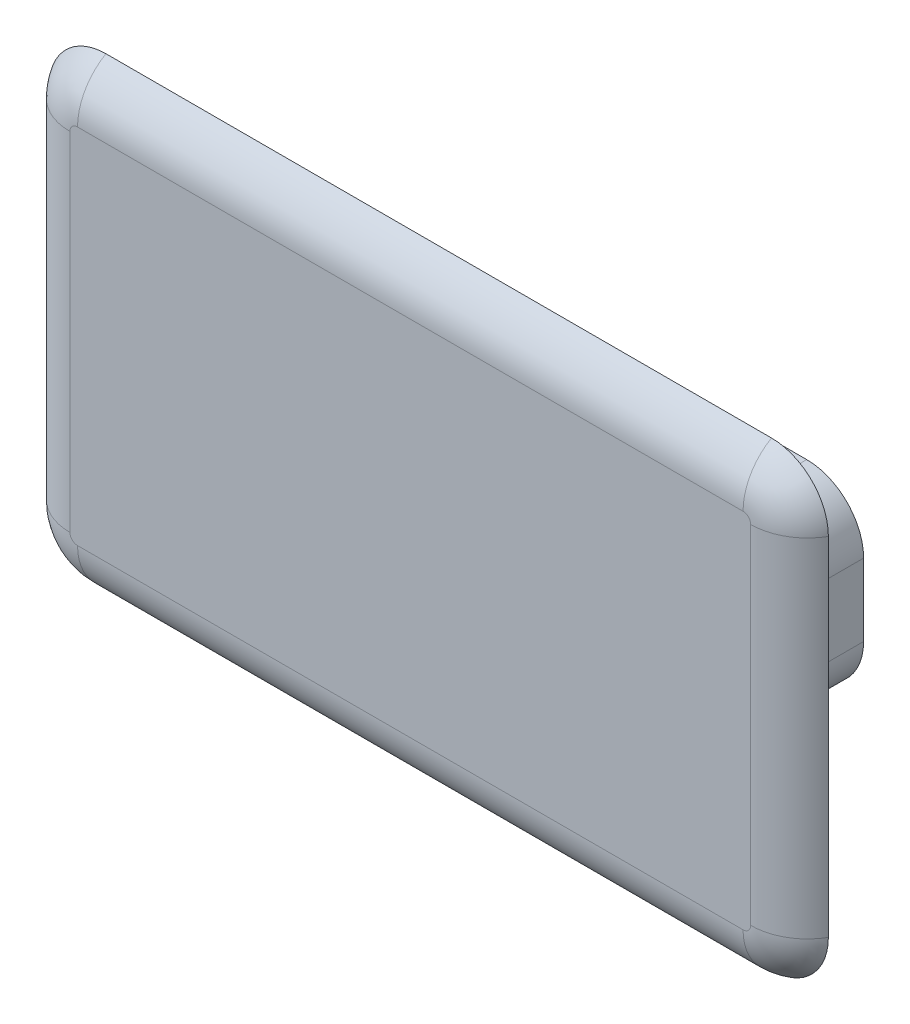
ISO-10303-21;
HEADER;
FILE_DESCRIPTION(('STEP AP214'),'2;1');
FILE_NAME('part.step','',(''),(''),'','','');
FILE_SCHEMA(('AUTOMOTIVE_DESIGN { 1 0 10303 214 1 1 1 1 }'));
ENDSEC;
DATA;
#1=APPLICATION_CONTEXT('core data for automotive mechanical design processes');
#2=APPLICATION_PROTOCOL_DEFINITION('international standard','automotive_design',2000,#1);
#3=PRODUCT_CONTEXT('',#1,'mechanical');
#4=PRODUCT('Part','Part','',(#3));
#5=PRODUCT_RELATED_PRODUCT_CATEGORY('part','',(#4));
#6=PRODUCT_DEFINITION_FORMATION('','',#4);
#7=PRODUCT_DEFINITION_CONTEXT('part definition',#1,'design');
#8=PRODUCT_DEFINITION('design','',#6,#7);
#9=PRODUCT_DEFINITION_SHAPE('','',#8);
#10=(LENGTH_UNIT() NAMED_UNIT(*) SI_UNIT(.MILLI.,.METRE.));
#11=(NAMED_UNIT(*) PLANE_ANGLE_UNIT() SI_UNIT($,.RADIAN.));
#12=(NAMED_UNIT(*) SI_UNIT($,.STERADIAN.) SOLID_ANGLE_UNIT());
#13=UNCERTAINTY_MEASURE_WITH_UNIT(LENGTH_MEASURE(1.E-05),#10,'distance_accuracy_value','');
#14=(GEOMETRIC_REPRESENTATION_CONTEXT(3) GLOBAL_UNCERTAINTY_ASSIGNED_CONTEXT((#13)) GLOBAL_UNIT_ASSIGNED_CONTEXT((#10,
#11,#12)) REPRESENTATION_CONTEXT('',''));
#15=CARTESIAN_POINT('',(0.,0.,0.));
#16=DIRECTION('',(0.,0.,1.));
#17=DIRECTION('',(1.,0.,0.));
#18=AXIS2_PLACEMENT_3D('',#15,#16,#17);
#19=CARTESIAN_POINT('',(0.,0.,3.));
#20=DIRECTION('',(0.,0.,-1.));
#21=DIRECTION('',(-1.,0.,0.));
#22=AXIS2_PLACEMENT_3D('',#19,#20,#21);
#23=PLANE('',#22);
#24=DIRECTION('',(0.,1.,0.));
#25=VECTOR('',#24,1.);
#26=CARTESIAN_POINT('',(0.86602540378444,0.,3.));
#27=LINE('',#26,#25);
#28=CARTESIAN_POINT('',(0.866025403784439,7.10538490601383,3.));
#29=VERTEX_POINT('',#28);
#30=CARTESIAN_POINT('',(0.86602540378444,1.,3.));
#31=VERTEX_POINT('',#30);
#32=EDGE_CURVE('E54',#29,#31,#27,.F.);
#33=ORIENTED_EDGE('',*,*,#32,.T.);
#34=CARTESIAN_POINT('',(1.,1.,3.));
#35=DIRECTION('',(0.,0.,-1.));
#36=DIRECTION('',(-1.,0.,0.));
#37=AXIS2_PLACEMENT_3D('',#34,#35,#36);
#38=CIRCLE('',#37,0.13397459621556);
#39=CARTESIAN_POINT('',(1.,0.86602540378444,3.));
#40=VERTEX_POINT('',#39);
#41=EDGE_CURVE('E11',#31,#40,#38,.F.);
#42=ORIENTED_EDGE('',*,*,#41,.T.);
#43=DIRECTION('',(-1.,0.,0.));
#44=VECTOR('',#43,1.);
#45=CARTESIAN_POINT('',(0.,0.86602540378444,3.));
#46=LINE('',#45,#44);
#47=CARTESIAN_POINT('',(12.7019601982615,0.86602540378444,3.));
#48=VERTEX_POINT('',#47);
#49=EDGE_CURVE('E424',#40,#48,#46,.F.);
#50=ORIENTED_EDGE('',*,*,#49,.T.);
#51=CARTESIAN_POINT('',(12.7019601982615,1.,3.));
#52=DIRECTION('',(0.,0.,-1.));
#53=DIRECTION('',(-1.,0.,0.));
#54=AXIS2_PLACEMENT_3D('',#51,#52,#53);
#55=CIRCLE('',#54,0.133974596215561);
#56=CARTESIAN_POINT('',(12.835934794477,1.,3.));
#57=VERTEX_POINT('',#56);
#58=EDGE_CURVE('E426',#48,#57,#55,.F.);
#59=ORIENTED_EDGE('',*,*,#58,.T.);
#60=DIRECTION('',(0.,-1.,0.));
#61=VECTOR('',#60,1.);
#62=CARTESIAN_POINT('',(12.835934794477,0.,3.));
#63=LINE('',#62,#61);
#64=CARTESIAN_POINT('',(12.835934794477,7.10538490601383,3.));
#65=VERTEX_POINT('',#64);
#66=EDGE_CURVE('E428',#57,#65,#63,.F.);
#67=ORIENTED_EDGE('',*,*,#66,.T.);
#68=CARTESIAN_POINT('',(12.7019601982615,7.10538490601383,3.));
#69=DIRECTION('',(0.,0.,-1.));
#70=DIRECTION('',(-1.,0.,0.));
#71=AXIS2_PLACEMENT_3D('',#68,#69,#70);
#72=CIRCLE('',#71,0.133974596215562);
#73=CARTESIAN_POINT('',(12.7019601982615,7.23935950222939,3.));
#74=VERTEX_POINT('',#73);
#75=EDGE_CURVE('E430',#65,#74,#72,.F.);
#76=ORIENTED_EDGE('',*,*,#75,.T.);
#77=DIRECTION('',(1.,0.,0.));
#78=VECTOR('',#77,1.);
#79=CARTESIAN_POINT('',(0.,7.23935950222939,3.));
#80=LINE('',#79,#78);
#81=CARTESIAN_POINT('',(1.,7.23935950222939,3.));
#82=VERTEX_POINT('',#81);
#83=EDGE_CURVE('E432',#74,#82,#80,.F.);
#84=ORIENTED_EDGE('',*,*,#83,.T.);
#85=CARTESIAN_POINT('',(1.,7.10538490601383,3.));
#86=DIRECTION('',(0.,0.,-1.));
#87=DIRECTION('',(-1.,0.,0.));
#88=AXIS2_PLACEMENT_3D('',#85,#86,#87);
#89=CIRCLE('',#88,0.133974596215561);
#90=EDGE_CURVE('E65',#82,#29,#89,.F.);
#91=ORIENTED_EDGE('',*,*,#90,.T.);
#92=EDGE_LOOP('',(#33,#42,#50,#59,#67,#76,#84,#91));
#93=FACE_BOUND('',#92,.T.);
#94=ADVANCED_FACE('F45',(#93),#23,.F.);
#95=CARTESIAN_POINT('',(40.7815614810318,-15.6441237529717,2.5));
#96=DIRECTION('',(0.,0.,-1.));
#97=DIRECTION('',(-1.,0.,0.));
#98=AXIS2_PLACEMENT_3D('',#95,#96,#97);
#99=PLANE('',#98);
#100=CARTESIAN_POINT('',(10.8215614810317,4.58587624702833,2.5));
#101=DIRECTION('',(0.,0.,-1.));
#102=DIRECTION('',(-1.,0.,0.));
#103=AXIS2_PLACEMENT_3D('',#100,#101,#102);
#104=CIRCLE('',#103,1.3);
#105=CARTESIAN_POINT('',(10.8215614810317,5.88587624702833,2.5));
#106=VERTEX_POINT('',#105);
#107=CARTESIAN_POINT('',(12.1215614810317,4.58587624702833,2.5));
#108=VERTEX_POINT('',#107);
#109=EDGE_CURVE('E338',#106,#108,#104,.T.);
#110=ORIENTED_EDGE('',*,*,#109,.F.);
#111=DIRECTION('',(1.,0.,0.));
#112=VECTOR('',#111,1.);
#113=CARTESIAN_POINT('',(40.7815614810317,5.88587624702833,2.5));
#114=LINE('',#113,#112);
#115=CARTESIAN_POINT('',(4.05156148103174,5.88587624702833,2.5));
#116=VERTEX_POINT('',#115);
#117=EDGE_CURVE('E334',#116,#106,#114,.T.);
#118=ORIENTED_EDGE('',*,*,#117,.F.);
#119=CARTESIAN_POINT('',(4.05156148103174,4.58587624702833,2.5));
#120=DIRECTION('',(0.,0.,-1.));
#121=DIRECTION('',(-1.,0.,0.));
#122=AXIS2_PLACEMENT_3D('',#119,#120,#121);
#123=CIRCLE('',#122,1.3);
#124=CARTESIAN_POINT('',(2.75156148103175,4.58587624702833,2.5));
#125=VERTEX_POINT('',#124);
#126=EDGE_CURVE('E330',#125,#116,#123,.T.);
#127=ORIENTED_EDGE('',*,*,#126,.F.);
#128=DIRECTION('',(0.,1.,0.));
#129=VECTOR('',#128,1.);
#130=CARTESIAN_POINT('',(2.75156148103176,-15.6441237529717,2.5));
#131=LINE('',#130,#129);
#132=CARTESIAN_POINT('',(2.75156148103175,3.31587624702833,2.5));
#133=VERTEX_POINT('',#132);
#134=EDGE_CURVE('E328',#133,#125,#131,.T.);
#135=ORIENTED_EDGE('',*,*,#134,.F.);
#136=CARTESIAN_POINT('',(4.05156148103175,3.31587624702833,2.5));
#137=DIRECTION('',(0.,0.,-1.));
#138=DIRECTION('',(-1.,0.,0.));
#139=AXIS2_PLACEMENT_3D('',#136,#137,#138);
#140=CIRCLE('',#139,1.3);
#141=CARTESIAN_POINT('',(4.05156148103175,2.01587624702834,2.5));
#142=VERTEX_POINT('',#141);
#143=EDGE_CURVE('E332',#142,#133,#140,.T.);
#144=ORIENTED_EDGE('',*,*,#143,.F.);
#145=DIRECTION('',(-1.,0.,0.));
#146=VECTOR('',#145,1.);
#147=CARTESIAN_POINT('',(40.7815614810317,2.01587624702834,2.5));
#148=LINE('',#147,#146);
#149=CARTESIAN_POINT('',(10.8215614810317,2.01587624702834,2.5));
#150=VERTEX_POINT('',#149);
#151=EDGE_CURVE('E336',#150,#142,#148,.T.);
#152=ORIENTED_EDGE('',*,*,#151,.F.);
#153=CARTESIAN_POINT('',(10.8215614810317,3.31587624702834,2.5));
#154=DIRECTION('',(0.,0.,-1.));
#155=DIRECTION('',(-1.,0.,0.));
#156=AXIS2_PLACEMENT_3D('',#153,#154,#155);
#157=CIRCLE('',#156,1.3);
#158=CARTESIAN_POINT('',(12.1215614810317,3.31587624702834,2.5));
#159=VERTEX_POINT('',#158);
#160=EDGE_CURVE('E340',#159,#150,#157,.T.);
#161=ORIENTED_EDGE('',*,*,#160,.F.);
#162=DIRECTION('',(0.,-1.,0.));
#163=VECTOR('',#162,1.);
#164=CARTESIAN_POINT('',(12.1215614810317,-15.6441237529717,2.5));
#165=LINE('',#164,#163);
#166=EDGE_CURVE('E342',#108,#159,#165,.T.);
#167=ORIENTED_EDGE('',*,*,#166,.F.);
#168=EDGE_LOOP('',(#110,#118,#127,#135,#144,#152,#161,#167));
#169=FACE_BOUND('',#168,.T.);
#170=DIRECTION('',(0.,-1.,0.));
#171=VECTOR('',#170,1.);
#172=CARTESIAN_POINT('',(13.7019601982615,0.,2.5));
#173=LINE('',#172,#171);
#174=CARTESIAN_POINT('',(13.7019601982615,7.10538490601383,2.5));
#175=VERTEX_POINT('',#174);
#176=CARTESIAN_POINT('',(13.7019601982615,1.,2.5));
#177=VERTEX_POINT('',#176);
#178=EDGE_CURVE('E363',#175,#177,#173,.T.);
#179=ORIENTED_EDGE('',*,*,#178,.T.);
#180=CARTESIAN_POINT('',(12.7019601982615,1.,2.5));
#181=DIRECTION('',(0.,0.,-1.));
#182=DIRECTION('',(0.,1.,0.));
#183=AXIS2_PLACEMENT_3D('',#180,#181,#182);
#184=CIRCLE('',#183,1.);
#185=CARTESIAN_POINT('',(12.7019601982615,0.,2.5));
#186=VERTEX_POINT('',#185);
#187=EDGE_CURVE('E422',#177,#186,#184,.T.);
#188=ORIENTED_EDGE('',*,*,#187,.T.);
#189=DIRECTION('',(-1.,0.,0.));
#190=VECTOR('',#189,1.);
#191=CARTESIAN_POINT('',(0.,0.,2.5));
#192=LINE('',#191,#190);
#193=CARTESIAN_POINT('',(1.,0.,2.5));
#194=VERTEX_POINT('',#193);
#195=EDGE_CURVE('E385',#186,#194,#192,.T.);
#196=ORIENTED_EDGE('',*,*,#195,.T.);
#197=CARTESIAN_POINT('',(1.,1.,2.5));
#198=DIRECTION('',(0.,0.,-1.));
#199=DIRECTION('',(0.,1.,0.));
#200=AXIS2_PLACEMENT_3D('',#197,#198,#199);
#201=CIRCLE('',#200,1.);
#202=CARTESIAN_POINT('',(0.,1.,2.5));
#203=VERTEX_POINT('',#202);
#204=EDGE_CURVE('E419',#194,#203,#201,.T.);
#205=ORIENTED_EDGE('',*,*,#204,.T.);
#206=DIRECTION('',(0.,1.,0.));
#207=VECTOR('',#206,1.);
#208=CARTESIAN_POINT('',(0.,0.,2.5));
#209=LINE('',#208,#207);
#210=CARTESIAN_POINT('',(0.,7.10538490601383,2.5));
#211=VERTEX_POINT('',#210);
#212=EDGE_CURVE('E387',#203,#211,#209,.T.);
#213=ORIENTED_EDGE('',*,*,#212,.T.);
#214=CARTESIAN_POINT('',(1.,7.10538490601383,2.5));
#215=DIRECTION('',(0.,0.,-1.));
#216=DIRECTION('',(0.,1.,0.));
#217=AXIS2_PLACEMENT_3D('',#214,#215,#216);
#218=CIRCLE('',#217,1.);
#219=CARTESIAN_POINT('',(1.,8.10538490601383,2.5));
#220=VERTEX_POINT('',#219);
#221=EDGE_CURVE('E415',#211,#220,#218,.T.);
#222=ORIENTED_EDGE('',*,*,#221,.T.);
#223=DIRECTION('',(1.,0.,0.));
#224=VECTOR('',#223,1.);
#225=CARTESIAN_POINT('',(0.,8.10538490601383,2.5));
#226=LINE('',#225,#224);
#227=CARTESIAN_POINT('',(12.7019601982615,8.10538490601383,2.5));
#228=VERTEX_POINT('',#227);
#229=EDGE_CURVE('E413',#220,#228,#226,.T.);
#230=ORIENTED_EDGE('',*,*,#229,.T.);
#231=CARTESIAN_POINT('',(12.7019601982615,7.10538490601383,2.5));
#232=DIRECTION('',(0.,0.,-1.));
#233=DIRECTION('',(0.,1.,0.));
#234=AXIS2_PLACEMENT_3D('',#231,#232,#233);
#235=CIRCLE('',#234,1.);
#236=EDGE_CURVE('E417',#228,#175,#235,.T.);
#237=ORIENTED_EDGE('',*,*,#236,.T.);
#238=EDGE_LOOP('',(#179,#188,#196,#205,#213,#222,#230,#237));
#239=FACE_BOUND('',#238,.T.);
#240=ADVANCED_FACE('F468',(#169,#239),#99,.T.);
#241=CARTESIAN_POINT('',(11.8215614810317,5.58587624702834,-7.5));
#242=DIRECTION('',(1.,0.,0.));
#243=DIRECTION('',(0.,0.,-1.));
#244=AXIS2_PLACEMENT_3D('',#241,#242,#243);
#245=PLANE('',#244);
#246=DIRECTION('',(0.,0.,1.));
#247=VECTOR('',#246,1.);
#248=CARTESIAN_POINT('',(11.8215614810317,4.58587624702833,-3.));
#249=LINE('',#248,#247);
#250=CARTESIAN_POINT('',(11.8215614810317,4.58587624702833,2.20000000000001));
#251=VERTEX_POINT('',#250);
#252=CARTESIAN_POINT('',(11.8215614810317,4.58587624702833,0.));
#253=VERTEX_POINT('',#252);
#254=EDGE_CURVE('E312',#251,#253,#249,.F.);
#255=ORIENTED_EDGE('',*,*,#254,.F.);
#256=DIRECTION('',(0.,1.,0.));
#257=VECTOR('',#256,1.);
#258=CARTESIAN_POINT('',(11.8215614810317,5.58587624702834,2.20000000000001));
#259=LINE('',#258,#257);
#260=CARTESIAN_POINT('',(11.8215614810317,3.31587624702834,2.20000000000001));
#261=VERTEX_POINT('',#260);
#262=EDGE_CURVE('E325',#261,#251,#259,.T.);
#263=ORIENTED_EDGE('',*,*,#262,.F.);
#264=DIRECTION('',(0.,0.,1.));
#265=VECTOR('',#264,1.);
#266=CARTESIAN_POINT('',(11.8215614810317,3.31587624702834,2.5));
#267=LINE('',#266,#265);
#268=CARTESIAN_POINT('',(11.8215614810317,3.31587624702834,0.));
#269=VERTEX_POINT('',#268);
#270=EDGE_CURVE('E310',#269,#261,#267,.T.);
#271=ORIENTED_EDGE('',*,*,#270,.F.);
#272=DIRECTION('',(0.,-1.,0.));
#273=VECTOR('',#272,1.);
#274=CARTESIAN_POINT('',(11.8215614810317,0.,0.));
#275=LINE('',#274,#273);
#276=EDGE_CURVE('E407',#253,#269,#275,.T.);
#277=ORIENTED_EDGE('',*,*,#276,.F.);
#278=EDGE_LOOP('',(#255,#263,#271,#277));
#279=FACE_BOUND('',#278,.T.);
#280=ADVANCED_FACE('F504',(#279),#245,.T.);
#281=CARTESIAN_POINT('',(3.05156148103175,2.31587624702833,-7.5));
#282=DIRECTION('',(0.,-1.,0.));
#283=DIRECTION('',(-1.,0.,0.));
#284=AXIS2_PLACEMENT_3D('',#281,#282,#283);
#285=PLANE('',#284);
#286=DIRECTION('',(0.,0.,1.));
#287=VECTOR('',#286,1.);
#288=CARTESIAN_POINT('',(10.8215614810317,2.31587624702834,-3.));
#289=LINE('',#288,#287);
#290=CARTESIAN_POINT('',(10.8215614810317,2.31587624702834,2.20000000000001));
#291=VERTEX_POINT('',#290);
#292=CARTESIAN_POINT('',(10.8215614810317,2.31587624702834,0.));
#293=VERTEX_POINT('',#292);
#294=EDGE_CURVE('E317',#291,#293,#289,.F.);
#295=ORIENTED_EDGE('',*,*,#294,.F.);
#296=DIRECTION('',(1.,0.,0.));
#297=VECTOR('',#296,1.);
#298=CARTESIAN_POINT('',(3.05156148103175,2.31587624702833,2.20000000000001));
#299=LINE('',#298,#297);
#300=CARTESIAN_POINT('',(4.05156148103175,2.31587624702833,2.20000000000001));
#301=VERTEX_POINT('',#300);
#302=EDGE_CURVE('E351',#301,#291,#299,.T.);
#303=ORIENTED_EDGE('',*,*,#302,.F.);
#304=DIRECTION('',(0.,0.,1.));
#305=VECTOR('',#304,1.);
#306=CARTESIAN_POINT('',(4.05156148103175,2.31587624702833,2.5));
#307=LINE('',#306,#305);
#308=CARTESIAN_POINT('',(4.05156148103175,2.31587624702833,0.));
#309=VERTEX_POINT('',#308);
#310=EDGE_CURVE('E315',#309,#301,#307,.T.);
#311=ORIENTED_EDGE('',*,*,#310,.F.);
#312=DIRECTION('',(-1.,0.,0.));
#313=VECTOR('',#312,1.);
#314=CARTESIAN_POINT('',(0.,2.31587624702833,0.));
#315=LINE('',#314,#313);
#316=EDGE_CURVE('E404',#293,#309,#315,.T.);
#317=ORIENTED_EDGE('',*,*,#316,.F.);
#318=EDGE_LOOP('',(#295,#303,#311,#317));
#319=FACE_BOUND('',#318,.T.);
#320=ADVANCED_FACE('F558',(#319),#285,.T.);
#321=CARTESIAN_POINT('',(3.05156148103175,5.58587624702833,-7.5));
#322=DIRECTION('',(-1.,0.,0.));
#323=DIRECTION('',(0.,0.,1.));
#324=AXIS2_PLACEMENT_3D('',#321,#322,#323);
#325=PLANE('',#324);
#326=DIRECTION('',(0.,0.,1.));
#327=VECTOR('',#326,1.);
#328=CARTESIAN_POINT('',(3.05156148103175,3.31587624702833,-3.));
#329=LINE('',#328,#327);
#330=CARTESIAN_POINT('',(3.05156148103175,3.31587624702833,2.20000000000001));
#331=VERTEX_POINT('',#330);
#332=CARTESIAN_POINT('',(3.05156148103175,3.31587624702833,0.));
#333=VERTEX_POINT('',#332);
#334=EDGE_CURVE('E322',#331,#333,#329,.F.);
#335=ORIENTED_EDGE('',*,*,#334,.F.);
#336=DIRECTION('',(0.,-1.,0.));
#337=VECTOR('',#336,1.);
#338=CARTESIAN_POINT('',(3.05156148103175,5.58587624702833,2.20000000000001));
#339=LINE('',#338,#337);
#340=CARTESIAN_POINT('',(3.05156148103175,4.58587624702833,2.20000000000001));
#341=VERTEX_POINT('',#340);
#342=EDGE_CURVE('E361',#341,#331,#339,.T.);
#343=ORIENTED_EDGE('',*,*,#342,.F.);
#344=DIRECTION('',(0.,0.,1.));
#345=VECTOR('',#344,1.);
#346=CARTESIAN_POINT('',(3.05156148103175,4.58587624702833,2.5));
#347=LINE('',#346,#345);
#348=CARTESIAN_POINT('',(3.05156148103175,4.58587624702833,0.));
#349=VERTEX_POINT('',#348);
#350=EDGE_CURVE('E320',#349,#341,#347,.T.);
#351=ORIENTED_EDGE('',*,*,#350,.F.);
#352=DIRECTION('',(0.,1.,0.));
#353=VECTOR('',#352,1.);
#354=CARTESIAN_POINT('',(3.05156148103175,0.,0.));
#355=LINE('',#354,#353);
#356=EDGE_CURVE('E395',#333,#349,#355,.T.);
#357=ORIENTED_EDGE('',*,*,#356,.F.);
#358=EDGE_LOOP('',(#335,#343,#351,#357));
#359=FACE_BOUND('',#358,.T.);
#360=ADVANCED_FACE('F567',(#359),#325,.T.);
#361=CARTESIAN_POINT('',(3.05156148103175,5.58587624702833,-7.5));
#362=DIRECTION('',(0.,1.,0.));
#363=DIRECTION('',(1.,0.,0.));
#364=AXIS2_PLACEMENT_3D('',#361,#362,#363);
#365=PLANE('',#364);
#366=DIRECTION('',(0.,0.,1.));
#367=VECTOR('',#366,1.);
#368=CARTESIAN_POINT('',(4.05156148103175,5.58587624702833,-3.));
#369=LINE('',#368,#367);
#370=CARTESIAN_POINT('',(4.05156148103174,5.58587624702833,2.20000000000001));
#371=VERTEX_POINT('',#370);
#372=CARTESIAN_POINT('',(4.05156148103175,5.58587624702833,0.));
#373=VERTEX_POINT('',#372);
#374=EDGE_CURVE('E305',#371,#373,#369,.F.);
#375=ORIENTED_EDGE('',*,*,#374,.F.);
#376=DIRECTION('',(-1.,0.,0.));
#377=VECTOR('',#376,1.);
#378=CARTESIAN_POINT('',(3.05156148103175,5.58587624702833,2.20000000000001));
#379=LINE('',#378,#377);
#380=CARTESIAN_POINT('',(10.8215614810317,5.58587624702834,2.20000000000001));
#381=VERTEX_POINT('',#380);
#382=EDGE_CURVE('E353',#381,#371,#379,.T.);
#383=ORIENTED_EDGE('',*,*,#382,.F.);
#384=DIRECTION('',(0.,0.,1.));
#385=VECTOR('',#384,1.);
#386=CARTESIAN_POINT('',(10.8215614810317,5.58587624702834,2.5));
#387=LINE('',#386,#385);
#388=CARTESIAN_POINT('',(10.8215614810317,5.58587624702834,0.));
#389=VERTEX_POINT('',#388);
#390=EDGE_CURVE('E307',#389,#381,#387,.T.);
#391=ORIENTED_EDGE('',*,*,#390,.F.);
#392=DIRECTION('',(1.,0.,0.));
#393=VECTOR('',#392,1.);
#394=CARTESIAN_POINT('',(0.,5.58587624702833,0.));
#395=LINE('',#394,#393);
#396=EDGE_CURVE('E392',#373,#389,#395,.T.);
#397=ORIENTED_EDGE('',*,*,#396,.F.);
#398=EDGE_LOOP('',(#375,#383,#391,#397));
#399=FACE_BOUND('',#398,.T.);
#400=ADVANCED_FACE('F630',(#399),#365,.T.);
#401=CARTESIAN_POINT('',(10.8215614810317,4.58587624702833,-7.5));
#402=DIRECTION('',(0.,0.,-1.));
#403=DIRECTION('',(-1.,0.,0.));
#404=AXIS2_PLACEMENT_3D('',#401,#402,#403);
#405=CYLINDRICAL_SURFACE('',#404,1.);
#406=ORIENTED_EDGE('',*,*,#390,.T.);
#407=CARTESIAN_POINT('',(10.8215614810317,4.58587624702833,2.20000000000001));
#408=DIRECTION('',(0.,0.,-1.));
#409=DIRECTION('',(-1.,0.,0.));
#410=AXIS2_PLACEMENT_3D('',#407,#408,#409);
#411=CIRCLE('',#410,1.);
#412=EDGE_CURVE('E348',#251,#381,#411,.F.);
#413=ORIENTED_EDGE('',*,*,#412,.F.);
#414=ORIENTED_EDGE('',*,*,#254,.T.);
#415=CARTESIAN_POINT('',(10.8215614810317,4.58587624702833,0.));
#416=DIRECTION('',(0.,0.,-1.));
#417=DIRECTION('',(-1.,0.,0.));
#418=AXIS2_PLACEMENT_3D('',#415,#416,#417);
#419=CIRCLE('',#418,1.);
#420=EDGE_CURVE('E401',#389,#253,#419,.T.);
#421=ORIENTED_EDGE('',*,*,#420,.F.);
#422=EDGE_LOOP('',(#406,#413,#414,#421));
#423=FACE_BOUND('',#422,.T.);
#424=ADVANCED_FACE('F533',(#423),#405,.T.);
#425=CARTESIAN_POINT('',(10.8215614810317,3.31587624702834,-7.5));
#426=DIRECTION('',(0.,0.,-1.));
#427=DIRECTION('',(-1.,0.,0.));
#428=AXIS2_PLACEMENT_3D('',#425,#426,#427);
#429=CYLINDRICAL_SURFACE('',#428,1.);
#430=ORIENTED_EDGE('',*,*,#270,.T.);
#431=CARTESIAN_POINT('',(10.8215614810317,3.31587624702834,2.20000000000001));
#432=DIRECTION('',(0.,0.,-1.));
#433=DIRECTION('',(-1.,0.,0.));
#434=AXIS2_PLACEMENT_3D('',#431,#432,#433);
#435=CIRCLE('',#434,1.);
#436=EDGE_CURVE('E345',#291,#261,#435,.F.);
#437=ORIENTED_EDGE('',*,*,#436,.F.);
#438=ORIENTED_EDGE('',*,*,#294,.T.);
#439=CARTESIAN_POINT('',(10.8215614810317,3.31587624702834,0.));
#440=DIRECTION('',(0.,0.,-1.));
#441=DIRECTION('',(-1.,0.,0.));
#442=AXIS2_PLACEMENT_3D('',#439,#440,#441);
#443=CIRCLE('',#442,1.);
#444=EDGE_CURVE('E410',#269,#293,#443,.T.);
#445=ORIENTED_EDGE('',*,*,#444,.F.);
#446=EDGE_LOOP('',(#430,#437,#438,#445));
#447=FACE_BOUND('',#446,.T.);
#448=ADVANCED_FACE('F556',(#447),#429,.T.);
#449=CARTESIAN_POINT('',(4.05156148103175,3.31587624702833,-7.5));
#450=DIRECTION('',(0.,0.,-1.));
#451=DIRECTION('',(-1.,0.,0.));
#452=AXIS2_PLACEMENT_3D('',#449,#450,#451);
#453=CYLINDRICAL_SURFACE('',#452,1.);
#454=ORIENTED_EDGE('',*,*,#310,.T.);
#455=CARTESIAN_POINT('',(4.05156148103175,3.31587624702833,2.20000000000001));
#456=DIRECTION('',(0.,0.,-1.));
#457=DIRECTION('',(-1.,0.,0.));
#458=AXIS2_PLACEMENT_3D('',#455,#456,#457);
#459=CIRCLE('',#458,1.);
#460=EDGE_CURVE('E355',#331,#301,#459,.F.);
#461=ORIENTED_EDGE('',*,*,#460,.F.);
#462=ORIENTED_EDGE('',*,*,#334,.T.);
#463=CARTESIAN_POINT('',(4.05156148103175,3.31587624702833,0.));
#464=DIRECTION('',(0.,0.,-1.));
#465=DIRECTION('',(-1.,0.,0.));
#466=AXIS2_PLACEMENT_3D('',#463,#464,#465);
#467=CIRCLE('',#466,1.);
#468=EDGE_CURVE('E398',#309,#333,#467,.T.);
#469=ORIENTED_EDGE('',*,*,#468,.F.);
#470=EDGE_LOOP('',(#454,#461,#462,#469));
#471=FACE_BOUND('',#470,.T.);
#472=ADVANCED_FACE('F561',(#471),#453,.T.);
#473=CARTESIAN_POINT('',(4.05156148103175,4.58587624702833,-7.5));
#474=DIRECTION('',(0.,0.,-1.));
#475=DIRECTION('',(-1.,0.,0.));
#476=AXIS2_PLACEMENT_3D('',#473,#474,#475);
#477=CYLINDRICAL_SURFACE('',#476,1.);
#478=ORIENTED_EDGE('',*,*,#350,.T.);
#479=CARTESIAN_POINT('',(4.05156148103174,4.58587624702833,2.20000000000001));
#480=DIRECTION('',(0.,0.,-1.));
#481=DIRECTION('',(-1.,0.,0.));
#482=AXIS2_PLACEMENT_3D('',#479,#480,#481);
#483=CIRCLE('',#482,1.);
#484=EDGE_CURVE('E358',#371,#341,#483,.F.);
#485=ORIENTED_EDGE('',*,*,#484,.F.);
#486=ORIENTED_EDGE('',*,*,#374,.T.);
#487=CARTESIAN_POINT('',(4.05156148103175,4.58587624702833,0.));
#488=DIRECTION('',(0.,0.,-1.));
#489=DIRECTION('',(-1.,0.,0.));
#490=AXIS2_PLACEMENT_3D('',#487,#488,#489);
#491=CIRCLE('',#490,1.);
#492=EDGE_CURVE('E389',#349,#373,#491,.T.);
#493=ORIENTED_EDGE('',*,*,#492,.F.);
#494=EDGE_LOOP('',(#478,#485,#486,#493));
#495=FACE_BOUND('',#494,.T.);
#496=ADVANCED_FACE('F617',(#495),#477,.T.);
#497=CARTESIAN_POINT('',(3.05156148103175,5.58587624702833,2.20000000000001));
#498=DIRECTION('',(-0.707106781186545,0.,-0.707106781186549));
#499=DIRECTION('',(0.,-1.,0.));
#500=AXIS2_PLACEMENT_3D('',#497,#498,#499);
#501=PLANE('',#500);
#502=DIRECTION('',(0.70710678118655,0.,-0.707106781186545));
#503=VECTOR('',#502,1.);
#504=CARTESIAN_POINT('',(2.75156148103175,4.58587624702833,2.5));
#505=LINE('',#504,#503);
#506=EDGE_CURVE('E379',#125,#341,#505,.T.);
#507=ORIENTED_EDGE('',*,*,#506,.T.);
#508=ORIENTED_EDGE('',*,*,#342,.T.);
#509=DIRECTION('',(-0.70710678118655,0.,0.707106781186545));
#510=VECTOR('',#509,1.);
#511=CARTESIAN_POINT('',(3.05156148103175,3.31587624702833,2.20000000000001));
#512=LINE('',#511,#510);
#513=EDGE_CURVE('E308',#331,#133,#512,.T.);
#514=ORIENTED_EDGE('',*,*,#513,.T.);
#515=ORIENTED_EDGE('',*,*,#134,.T.);
#516=EDGE_LOOP('',(#507,#508,#514,#515));
#517=FACE_BOUND('',#516,.T.);
#518=ADVANCED_FACE('F510',(#517),#501,.T.);
#519=CARTESIAN_POINT('',(4.05156148103175,3.31587624702833,2.5));
#520=DIRECTION('',(0.,0.,1.));
#521=DIRECTION('',(1.,0.,0.));
#522=AXIS2_PLACEMENT_3D('',#519,#520,#521);
#523=CONICAL_SURFACE('',#522,1.3,0.78539816339745);
#524=ORIENTED_EDGE('',*,*,#513,.F.);
#525=ORIENTED_EDGE('',*,*,#460,.T.);
#526=DIRECTION('',(0.,-0.707106781186547,0.707106781186547));
#527=VECTOR('',#526,1.);
#528=CARTESIAN_POINT('',(4.05156148103175,2.31587624702833,2.20000000000001));
#529=LINE('',#528,#527);
#530=EDGE_CURVE('E376',#301,#142,#529,.T.);
#531=ORIENTED_EDGE('',*,*,#530,.T.);
#532=ORIENTED_EDGE('',*,*,#143,.T.);
#533=EDGE_LOOP('',(#524,#525,#531,#532));
#534=FACE_BOUND('',#533,.T.);
#535=ADVANCED_FACE('F570',(#534),#523,.T.);
#536=CARTESIAN_POINT('',(4.05156148103174,4.58587624702833,2.5));
#537=DIRECTION('',(0.,0.,1.));
#538=DIRECTION('',(1.,0.,0.));
#539=AXIS2_PLACEMENT_3D('',#536,#537,#538);
#540=CONICAL_SURFACE('',#539,1.29999999999999,0.785398163397447);
#541=ORIENTED_EDGE('',*,*,#506,.F.);
#542=ORIENTED_EDGE('',*,*,#126,.T.);
#543=DIRECTION('',(0.,-0.707106781186547,-0.707106781186547));
#544=VECTOR('',#543,1.);
#545=CARTESIAN_POINT('',(4.05156148103174,5.88587624702833,2.5));
#546=LINE('',#545,#544);
#547=EDGE_CURVE('E373',#116,#371,#546,.T.);
#548=ORIENTED_EDGE('',*,*,#547,.T.);
#549=ORIENTED_EDGE('',*,*,#484,.T.);
#550=EDGE_LOOP('',(#541,#542,#548,#549));
#551=FACE_BOUND('',#550,.T.);
#552=ADVANCED_FACE('F575',(#551),#540,.T.);
#553=CARTESIAN_POINT('',(3.05156148103175,2.31587624702833,2.20000000000001));
#554=DIRECTION('',(0.,-0.707106781186547,-0.707106781186547));
#555=DIRECTION('',(1.,0.,0.));
#556=AXIS2_PLACEMENT_3D('',#553,#554,#555);
#557=PLANE('',#556);
#558=ORIENTED_EDGE('',*,*,#530,.F.);
#559=ORIENTED_EDGE('',*,*,#302,.T.);
#560=DIRECTION('',(0.,-0.707106781186547,0.707106781186547));
#561=VECTOR('',#560,1.);
#562=CARTESIAN_POINT('',(10.8215614810317,2.31587624702834,2.20000000000001));
#563=LINE('',#562,#561);
#564=EDGE_CURVE('E370',#291,#150,#563,.T.);
#565=ORIENTED_EDGE('',*,*,#564,.T.);
#566=ORIENTED_EDGE('',*,*,#151,.T.);
#567=EDGE_LOOP('',(#558,#559,#565,#566));
#568=FACE_BOUND('',#567,.T.);
#569=ADVANCED_FACE('F552',(#568),#557,.T.);
#570=CARTESIAN_POINT('',(3.05156148103175,5.58587624702833,2.20000000000001));
#571=DIRECTION('',(0.,0.707106781186547,-0.707106781186547));
#572=DIRECTION('',(-1.,0.,0.));
#573=AXIS2_PLACEMENT_3D('',#570,#571,#572);
#574=PLANE('',#573);
#575=ORIENTED_EDGE('',*,*,#547,.F.);
#576=ORIENTED_EDGE('',*,*,#117,.T.);
#577=DIRECTION('',(0.,-0.707106781186547,-0.707106781186547));
#578=VECTOR('',#577,1.);
#579=CARTESIAN_POINT('',(10.8215614810317,5.88587624702833,2.5));
#580=LINE('',#579,#578);
#581=EDGE_CURVE('E367',#106,#381,#580,.T.);
#582=ORIENTED_EDGE('',*,*,#581,.T.);
#583=ORIENTED_EDGE('',*,*,#382,.T.);
#584=EDGE_LOOP('',(#575,#576,#582,#583));
#585=FACE_BOUND('',#584,.T.);
#586=ADVANCED_FACE('F580',(#585),#574,.T.);
#587=CARTESIAN_POINT('',(10.8215614810317,3.31587624702834,2.5));
#588=DIRECTION('',(0.,0.,1.));
#589=DIRECTION('',(1.,0.,0.));
#590=AXIS2_PLACEMENT_3D('',#587,#588,#589);
#591=CONICAL_SURFACE('',#590,1.3,0.78539816339745);
#592=ORIENTED_EDGE('',*,*,#564,.F.);
#593=ORIENTED_EDGE('',*,*,#436,.T.);
#594=DIRECTION('',(0.707106781186547,0.,0.707106781186547));
#595=VECTOR('',#594,1.);
#596=CARTESIAN_POINT('',(11.8215614810317,3.31587624702834,2.20000000000001));
#597=LINE('',#596,#595);
#598=EDGE_CURVE('E365',#261,#159,#597,.T.);
#599=ORIENTED_EDGE('',*,*,#598,.T.);
#600=ORIENTED_EDGE('',*,*,#160,.T.);
#601=EDGE_LOOP('',(#592,#593,#599,#600));
#602=FACE_BOUND('',#601,.T.);
#603=ADVANCED_FACE('F544',(#602),#591,.T.);
#604=CARTESIAN_POINT('',(10.8215614810317,4.58587624702833,2.5));
#605=DIRECTION('',(0.,0.,1.));
#606=DIRECTION('',(1.,0.,0.));
#607=AXIS2_PLACEMENT_3D('',#604,#605,#606);
#608=CONICAL_SURFACE('',#607,1.3,0.78539816339745);
#609=ORIENTED_EDGE('',*,*,#581,.F.);
#610=ORIENTED_EDGE('',*,*,#109,.T.);
#611=DIRECTION('',(-0.707106781186547,0.,-0.707106781186547));
#612=VECTOR('',#611,1.);
#613=CARTESIAN_POINT('',(12.1215614810317,4.58587624702833,2.5));
#614=LINE('',#613,#612);
#615=EDGE_CURVE('E293',#108,#251,#614,.T.);
#616=ORIENTED_EDGE('',*,*,#615,.T.);
#617=ORIENTED_EDGE('',*,*,#412,.T.);
#618=EDGE_LOOP('',(#609,#610,#616,#617));
#619=FACE_BOUND('',#618,.T.);
#620=ADVANCED_FACE('F522',(#619),#608,.T.);
#621=CARTESIAN_POINT('',(11.8215614810317,5.58587624702834,2.20000000000001));
#622=DIRECTION('',(0.707106781186548,0.,-0.707106781186547));
#623=DIRECTION('',(0.,1.,0.));
#624=AXIS2_PLACEMENT_3D('',#621,#622,#623);
#625=PLANE('',#624);
#626=ORIENTED_EDGE('',*,*,#598,.F.);
#627=ORIENTED_EDGE('',*,*,#262,.T.);
#628=ORIENTED_EDGE('',*,*,#615,.F.);
#629=ORIENTED_EDGE('',*,*,#166,.T.);
#630=EDGE_LOOP('',(#626,#627,#628,#629));
#631=FACE_BOUND('',#630,.T.);
#632=ADVANCED_FACE('F514',(#631),#625,.T.);
#633=CARTESIAN_POINT('',(0.,0.,0.));
#634=DIRECTION('',(0.,0.,-1.));
#635=DIRECTION('',(-1.,0.,0.));
#636=AXIS2_PLACEMENT_3D('',#633,#634,#635);
#637=PLANE('',#636);
#638=DIRECTION('',(0.,1.,0.));
#639=VECTOR('',#638,1.);
#640=CARTESIAN_POINT('',(3.85156148103175,0.,0.));
#641=LINE('',#640,#639);
#642=CARTESIAN_POINT('',(3.85156148103175,3.31587624702833,0.));
#643=VERTEX_POINT('',#642);
#644=CARTESIAN_POINT('',(3.85156148103175,4.58587624702833,0.));
#645=VERTEX_POINT('',#644);
#646=EDGE_CURVE('E237',#643,#645,#641,.T.);
#647=ORIENTED_EDGE('',*,*,#646,.F.);
#648=CARTESIAN_POINT('',(4.05156148103175,3.31587624702833,0.));
#649=DIRECTION('',(0.,0.,-1.));
#650=DIRECTION('',(-1.,0.,0.));
#651=AXIS2_PLACEMENT_3D('',#648,#649,#650);
#652=CIRCLE('',#651,0.199999999999997);
#653=CARTESIAN_POINT('',(4.05156148103175,3.11587624702834,0.));
#654=VERTEX_POINT('',#653);
#655=EDGE_CURVE('E255',#654,#643,#652,.T.);
#656=ORIENTED_EDGE('',*,*,#655,.F.);
#657=DIRECTION('',(-1.,0.,0.));
#658=VECTOR('',#657,1.);
#659=CARTESIAN_POINT('',(0.,3.11587624702834,0.));
#660=LINE('',#659,#658);
#661=CARTESIAN_POINT('',(10.8215614810317,3.11587624702834,0.));
#662=VERTEX_POINT('',#661);
#663=EDGE_CURVE('E258',#662,#654,#660,.T.);
#664=ORIENTED_EDGE('',*,*,#663,.F.);
#665=CARTESIAN_POINT('',(10.8215614810317,3.31587624702834,0.));
#666=DIRECTION('',(0.,0.,-1.));
#667=DIRECTION('',(-1.,0.,0.));
#668=AXIS2_PLACEMENT_3D('',#665,#666,#667);
#669=CIRCLE('',#668,0.200000000000001);
#670=CARTESIAN_POINT('',(11.0215614810317,3.31587624702834,0.));
#671=VERTEX_POINT('',#670);
#672=EDGE_CURVE('E286',#671,#662,#669,.T.);
#673=ORIENTED_EDGE('',*,*,#672,.F.);
#674=DIRECTION('',(0.,-1.,0.));
#675=VECTOR('',#674,1.);
#676=CARTESIAN_POINT('',(11.0215614810317,0.,0.));
#677=LINE('',#676,#675);
#678=CARTESIAN_POINT('',(11.0215614810317,4.58587624702833,0.));
#679=VERTEX_POINT('',#678);
#680=EDGE_CURVE('E283',#679,#671,#677,.T.);
#681=ORIENTED_EDGE('',*,*,#680,.F.);
#682=CARTESIAN_POINT('',(10.8215614810317,4.58587624702834,0.));
#683=DIRECTION('',(0.,0.,-1.));
#684=DIRECTION('',(-1.,0.,0.));
#685=AXIS2_PLACEMENT_3D('',#682,#683,#684);
#686=CIRCLE('',#685,0.200000000000001);
#687=CARTESIAN_POINT('',(10.8215614810317,4.78587624702834,0.));
#688=VERTEX_POINT('',#687);
#689=EDGE_CURVE('E280',#688,#679,#686,.T.);
#690=ORIENTED_EDGE('',*,*,#689,.F.);
#691=DIRECTION('',(1.,0.,0.));
#692=VECTOR('',#691,1.);
#693=CARTESIAN_POINT('',(0.,4.78587624702833,0.));
#694=LINE('',#693,#692);
#695=CARTESIAN_POINT('',(4.05156148103174,4.78587624702833,0.));
#696=VERTEX_POINT('',#695);
#697=EDGE_CURVE('E277',#696,#688,#694,.T.);
#698=ORIENTED_EDGE('',*,*,#697,.F.);
#699=CARTESIAN_POINT('',(4.05156148103174,4.58587624702833,0.));
#700=DIRECTION('',(0.,0.,-1.));
#701=DIRECTION('',(-1.,0.,0.));
#702=AXIS2_PLACEMENT_3D('',#699,#700,#701);
#703=CIRCLE('',#702,0.199999999999998);
#704=EDGE_CURVE('E275',#645,#696,#703,.T.);
#705=ORIENTED_EDGE('',*,*,#704,.F.);
#706=EDGE_LOOP('',(#647,#656,#664,#673,#681,#690,#698,#705));
#707=FACE_BOUND('',#706,.T.);
#708=ORIENTED_EDGE('',*,*,#276,.T.);
#709=ORIENTED_EDGE('',*,*,#444,.T.);
#710=ORIENTED_EDGE('',*,*,#316,.T.);
#711=ORIENTED_EDGE('',*,*,#468,.T.);
#712=ORIENTED_EDGE('',*,*,#356,.T.);
#713=ORIENTED_EDGE('',*,*,#492,.T.);
#714=ORIENTED_EDGE('',*,*,#396,.T.);
#715=ORIENTED_EDGE('',*,*,#420,.T.);
#716=EDGE_LOOP('',(#708,#709,#710,#711,#712,#713,#714,#715));
#717=FACE_BOUND('',#716,.T.);
#718=ADVANCED_FACE('F512',(#707,#717),#637,.T.);
#719=CARTESIAN_POINT('',(3.85156148103175,0.,1.5));
#720=DIRECTION('',(-1.,0.,0.));
#721=DIRECTION('',(0.,0.,1.));
#722=AXIS2_PLACEMENT_3D('',#719,#720,#721);
#723=PLANE('',#722);
#724=ORIENTED_EDGE('',*,*,#646,.T.);
#725=DIRECTION('',(0.,0.,-1.));
#726=VECTOR('',#725,1.);
#727=CARTESIAN_POINT('',(3.85156148103175,4.58587624702833,1.5));
#728=LINE('',#727,#726);
#729=CARTESIAN_POINT('',(3.85156148103175,4.58587624702833,1.5));
#730=VERTEX_POINT('',#729);
#731=EDGE_CURVE('E230',#730,#645,#728,.T.);
#732=ORIENTED_EDGE('',*,*,#731,.F.);
#733=DIRECTION('',(0.,1.,0.));
#734=VECTOR('',#733,1.);
#735=CARTESIAN_POINT('',(3.85156148103175,0.,1.5));
#736=LINE('',#735,#734);
#737=CARTESIAN_POINT('',(3.85156148103175,3.31587624702833,1.5));
#738=VERTEX_POINT('',#737);
#739=EDGE_CURVE('E234',#738,#730,#736,.T.);
#740=ORIENTED_EDGE('',*,*,#739,.F.);
#741=DIRECTION('',(0.,0.,-1.));
#742=VECTOR('',#741,1.);
#743=CARTESIAN_POINT('',(3.85156148103175,3.31587624702833,1.5));
#744=LINE('',#743,#742);
#745=EDGE_CURVE('E291',#738,#643,#744,.T.);
#746=ORIENTED_EDGE('',*,*,#745,.T.);
#747=EDGE_LOOP('',(#724,#732,#740,#746));
#748=FACE_BOUND('',#747,.T.);
#749=ADVANCED_FACE('F232',(#748),#723,.F.);
#750=CARTESIAN_POINT('',(4.05156148103175,3.31587624702833,1.5));
#751=DIRECTION('',(0.,0.,-1.));
#752=DIRECTION('',(-1.,0.,0.));
#753=AXIS2_PLACEMENT_3D('',#750,#751,#752);
#754=CYLINDRICAL_SURFACE('',#753,0.199999999999997);
#755=ORIENTED_EDGE('',*,*,#655,.T.);
#756=ORIENTED_EDGE('',*,*,#745,.F.);
#757=CARTESIAN_POINT('',(4.05156148103175,3.31587624702833,1.5));
#758=DIRECTION('',(0.,0.,-1.));
#759=DIRECTION('',(-1.,0.,0.));
#760=AXIS2_PLACEMENT_3D('',#757,#758,#759);
#761=CIRCLE('',#760,0.199999999999997);
#762=CARTESIAN_POINT('',(4.05156148103175,3.11587624702834,1.5));
#763=VERTEX_POINT('',#762);
#764=EDGE_CURVE('E242',#763,#738,#761,.T.);
#765=ORIENTED_EDGE('',*,*,#764,.F.);
#766=DIRECTION('',(0.,0.,-1.));
#767=VECTOR('',#766,1.);
#768=CARTESIAN_POINT('',(4.05156148103175,3.11587624702834,1.5));
#769=LINE('',#768,#767);
#770=EDGE_CURVE('E294',#763,#654,#769,.T.);
#771=ORIENTED_EDGE('',*,*,#770,.T.);
#772=EDGE_LOOP('',(#755,#756,#765,#771));
#773=FACE_BOUND('',#772,.T.);
#774=ADVANCED_FACE('F520',(#773),#754,.F.);
#775=CARTESIAN_POINT('',(0.,3.11587624702834,1.5));
#776=DIRECTION('',(0.,-1.,0.));
#777=DIRECTION('',(0.,0.,-1.));
#778=AXIS2_PLACEMENT_3D('',#775,#776,#777);
#779=PLANE('',#778);
#780=ORIENTED_EDGE('',*,*,#663,.T.);
#781=ORIENTED_EDGE('',*,*,#770,.F.);
#782=DIRECTION('',(-1.,0.,0.));
#783=VECTOR('',#782,1.);
#784=CARTESIAN_POINT('',(0.,3.11587624702834,1.5));
#785=LINE('',#784,#783);
#786=CARTESIAN_POINT('',(10.8215614810317,3.11587624702834,1.5));
#787=VERTEX_POINT('',#786);
#788=EDGE_CURVE('E271',#787,#763,#785,.T.);
#789=ORIENTED_EDGE('',*,*,#788,.F.);
#790=DIRECTION('',(0.,0.,-1.));
#791=VECTOR('',#790,1.);
#792=CARTESIAN_POINT('',(10.8215614810317,3.11587624702834,1.5));
#793=LINE('',#792,#791);
#794=EDGE_CURVE('E296',#787,#662,#793,.T.);
#795=ORIENTED_EDGE('',*,*,#794,.T.);
#796=EDGE_LOOP('',(#780,#781,#789,#795));
#797=FACE_BOUND('',#796,.T.);
#798=ADVANCED_FACE('F658',(#797),#779,.F.);
#799=CARTESIAN_POINT('',(10.8215614810317,3.31587624702834,1.5));
#800=DIRECTION('',(0.,0.,-1.));
#801=DIRECTION('',(-1.,0.,0.));
#802=AXIS2_PLACEMENT_3D('',#799,#800,#801);
#803=CYLINDRICAL_SURFACE('',#802,0.200000000000001);
#804=ORIENTED_EDGE('',*,*,#672,.T.);
#805=ORIENTED_EDGE('',*,*,#794,.F.);
#806=CARTESIAN_POINT('',(10.8215614810317,3.31587624702834,1.5));
#807=DIRECTION('',(0.,0.,-1.));
#808=DIRECTION('',(-1.,0.,0.));
#809=AXIS2_PLACEMENT_3D('',#806,#807,#808);
#810=CIRCLE('',#809,0.200000000000001);
#811=CARTESIAN_POINT('',(11.0215614810317,3.31587624702834,1.5));
#812=VERTEX_POINT('',#811);
#813=EDGE_CURVE('E268',#812,#787,#810,.T.);
#814=ORIENTED_EDGE('',*,*,#813,.F.);
#815=DIRECTION('',(0.,0.,-1.));
#816=VECTOR('',#815,1.);
#817=CARTESIAN_POINT('',(11.0215614810317,3.31587624702834,1.5));
#818=LINE('',#817,#816);
#819=EDGE_CURVE('E298',#812,#671,#818,.T.);
#820=ORIENTED_EDGE('',*,*,#819,.T.);
#821=EDGE_LOOP('',(#804,#805,#814,#820));
#822=FACE_BOUND('',#821,.T.);
#823=ADVANCED_FACE('F654',(#822),#803,.F.);
#824=CARTESIAN_POINT('',(11.0215614810317,0.,1.5));
#825=DIRECTION('',(1.,0.,0.));
#826=DIRECTION('',(0.,0.,-1.));
#827=AXIS2_PLACEMENT_3D('',#824,#825,#826);
#828=PLANE('',#827);
#829=ORIENTED_EDGE('',*,*,#680,.T.);
#830=ORIENTED_EDGE('',*,*,#819,.F.);
#831=DIRECTION('',(0.,-1.,0.));
#832=VECTOR('',#831,1.);
#833=CARTESIAN_POINT('',(11.0215614810317,0.,1.5));
#834=LINE('',#833,#832);
#835=CARTESIAN_POINT('',(11.0215614810317,4.58587624702833,1.5));
#836=VERTEX_POINT('',#835);
#837=EDGE_CURVE('E265',#836,#812,#834,.T.);
#838=ORIENTED_EDGE('',*,*,#837,.F.);
#839=DIRECTION('',(0.,0.,-1.));
#840=VECTOR('',#839,1.);
#841=CARTESIAN_POINT('',(11.0215614810317,4.58587624702833,1.5));
#842=LINE('',#841,#840);
#843=EDGE_CURVE('E300',#836,#679,#842,.T.);
#844=ORIENTED_EDGE('',*,*,#843,.T.);
#845=EDGE_LOOP('',(#829,#830,#838,#844));
#846=FACE_BOUND('',#845,.T.);
#847=ADVANCED_FACE('F650',(#846),#828,.F.);
#848=CARTESIAN_POINT('',(10.8215614810317,4.58587624702834,1.5));
#849=DIRECTION('',(0.,0.,-1.));
#850=DIRECTION('',(-1.,0.,0.));
#851=AXIS2_PLACEMENT_3D('',#848,#849,#850);
#852=CYLINDRICAL_SURFACE('',#851,0.200000000000001);
#853=ORIENTED_EDGE('',*,*,#689,.T.);
#854=ORIENTED_EDGE('',*,*,#843,.F.);
#855=CARTESIAN_POINT('',(10.8215614810317,4.58587624702834,1.5));
#856=DIRECTION('',(0.,0.,-1.));
#857=DIRECTION('',(-1.,0.,0.));
#858=AXIS2_PLACEMENT_3D('',#855,#856,#857);
#859=CIRCLE('',#858,0.200000000000001);
#860=CARTESIAN_POINT('',(10.8215614810317,4.78587624702834,1.5));
#861=VERTEX_POINT('',#860);
#862=EDGE_CURVE('E262',#861,#836,#859,.T.);
#863=ORIENTED_EDGE('',*,*,#862,.F.);
#864=DIRECTION('',(0.,0.,-1.));
#865=VECTOR('',#864,1.);
#866=CARTESIAN_POINT('',(10.8215614810317,4.78587624702834,1.5));
#867=LINE('',#866,#865);
#868=EDGE_CURVE('E302',#861,#688,#867,.T.);
#869=ORIENTED_EDGE('',*,*,#868,.T.);
#870=EDGE_LOOP('',(#853,#854,#863,#869));
#871=FACE_BOUND('',#870,.T.);
#872=ADVANCED_FACE('F646',(#871),#852,.F.);
#873=CARTESIAN_POINT('',(0.,4.78587624702833,1.5));
#874=DIRECTION('',(0.,1.,0.));
#875=DIRECTION('',(-1.,0.,0.));
#876=AXIS2_PLACEMENT_3D('',#873,#874,#875);
#877=PLANE('',#876);
#878=ORIENTED_EDGE('',*,*,#697,.T.);
#879=ORIENTED_EDGE('',*,*,#868,.F.);
#880=DIRECTION('',(1.,0.,0.));
#881=VECTOR('',#880,1.);
#882=CARTESIAN_POINT('',(0.,4.78587624702833,1.5));
#883=LINE('',#882,#881);
#884=CARTESIAN_POINT('',(4.05156148103174,4.78587624702833,1.5));
#885=VERTEX_POINT('',#884);
#886=EDGE_CURVE('E250',#885,#861,#883,.T.);
#887=ORIENTED_EDGE('',*,*,#886,.F.);
#888=DIRECTION('',(0.,0.,-1.));
#889=VECTOR('',#888,1.);
#890=CARTESIAN_POINT('',(4.05156148103174,4.78587624702833,1.5));
#891=LINE('',#890,#889);
#892=EDGE_CURVE('E241',#885,#696,#891,.T.);
#893=ORIENTED_EDGE('',*,*,#892,.T.);
#894=EDGE_LOOP('',(#878,#879,#887,#893));
#895=FACE_BOUND('',#894,.T.);
#896=ADVANCED_FACE('F643',(#895),#877,.F.);
#897=CARTESIAN_POINT('',(4.05156148103174,4.58587624702833,1.5));
#898=DIRECTION('',(0.,0.,-1.));
#899=DIRECTION('',(-1.,0.,0.));
#900=AXIS2_PLACEMENT_3D('',#897,#898,#899);
#901=CYLINDRICAL_SURFACE('',#900,0.199999999999998);
#902=ORIENTED_EDGE('',*,*,#704,.T.);
#903=ORIENTED_EDGE('',*,*,#892,.F.);
#904=CARTESIAN_POINT('',(4.05156148103174,4.58587624702833,1.5));
#905=DIRECTION('',(0.,0.,-1.));
#906=DIRECTION('',(-1.,0.,0.));
#907=AXIS2_PLACEMENT_3D('',#904,#905,#906);
#908=CIRCLE('',#907,0.199999999999998);
#909=EDGE_CURVE('E245',#730,#885,#908,.T.);
#910=ORIENTED_EDGE('',*,*,#909,.F.);
#911=ORIENTED_EDGE('',*,*,#731,.T.);
#912=EDGE_LOOP('',(#902,#903,#910,#911));
#913=FACE_BOUND('',#912,.T.);
#914=ADVANCED_FACE('F246',(#913),#901,.F.);
#915=CARTESIAN_POINT('',(0.,0.,1.5));
#916=DIRECTION('',(0.,0.,-1.));
#917=DIRECTION('',(-1.,0.,0.));
#918=AXIS2_PLACEMENT_3D('',#915,#916,#917);
#919=PLANE('',#918);
#920=ORIENTED_EDGE('',*,*,#739,.T.);
#921=ORIENTED_EDGE('',*,*,#909,.T.);
#922=ORIENTED_EDGE('',*,*,#886,.T.);
#923=ORIENTED_EDGE('',*,*,#862,.T.);
#924=ORIENTED_EDGE('',*,*,#837,.T.);
#925=ORIENTED_EDGE('',*,*,#813,.T.);
#926=ORIENTED_EDGE('',*,*,#788,.T.);
#927=ORIENTED_EDGE('',*,*,#764,.T.);
#928=EDGE_LOOP('',(#920,#921,#922,#923,#924,#925,#926,#927));
#929=FACE_BOUND('',#928,.T.);
#930=ADVANCED_FACE('F252',(#929),#919,.T.);
#931=CARTESIAN_POINT('',(12.7019601982615,7.10538490601383,2.));
#932=DIRECTION('',(0.,0.,1.));
#933=DIRECTION('',(1.,0.,0.));
#934=AXIS2_PLACEMENT_3D('',#931,#932,#933);
#935=DEGENERATE_TOROIDAL_SURFACE('',#934,0.133974596215562,1.,.T.);
#936=CARTESIAN_POINT('',(12.835934794477,7.10538490601383,2.));
#937=DIRECTION('',(0.,-1.,0.));
#938=DIRECTION('',(0.,0.,-1.));
#939=AXIS2_PLACEMENT_3D('',#936,#937,#938);
#940=CIRCLE('',#939,1.);
#941=EDGE_CURVE('E451',#175,#65,#940,.T.);
#942=ORIENTED_EDGE('',*,*,#941,.F.);
#943=ORIENTED_EDGE('',*,*,#236,.F.);
#944=CARTESIAN_POINT('',(12.7019601982615,7.23935950222939,2.));
#945=DIRECTION('',(-1.,0.,0.));
#946=DIRECTION('',(0.,0.,1.));
#947=AXIS2_PLACEMENT_3D('',#944,#945,#946);
#948=CIRCLE('',#947,1.);
#949=EDGE_CURVE('E49',#74,#228,#948,.T.);
#950=ORIENTED_EDGE('',*,*,#949,.F.);
#951=ORIENTED_EDGE('',*,*,#75,.F.);
#952=EDGE_LOOP('',(#942,#943,#950,#951));
#953=FACE_BOUND('',#952,.T.);
#954=ADVANCED_FACE('F47',(#953),#935,.T.);
#955=CARTESIAN_POINT('',(0.,7.23935950222939,2.));
#956=DIRECTION('',(1.,0.,0.));
#957=DIRECTION('',(0.,0.,-1.));
#958=AXIS2_PLACEMENT_3D('',#955,#956,#957);
#959=CYLINDRICAL_SURFACE('',#958,1.);
#960=ORIENTED_EDGE('',*,*,#949,.T.);
#961=ORIENTED_EDGE('',*,*,#229,.F.);
#962=CARTESIAN_POINT('',(1.,7.23935950222939,2.));
#963=DIRECTION('',(-1.,0.,0.));
#964=DIRECTION('',(0.,0.,1.));
#965=AXIS2_PLACEMENT_3D('',#962,#963,#964);
#966=CIRCLE('',#965,1.);
#967=EDGE_CURVE('E449',#82,#220,#966,.T.);
#968=ORIENTED_EDGE('',*,*,#967,.F.);
#969=ORIENTED_EDGE('',*,*,#83,.F.);
#970=EDGE_LOOP('',(#960,#961,#968,#969));
#971=FACE_BOUND('',#970,.T.);
#972=ADVANCED_FACE('F462',(#971),#959,.T.);
#973=CARTESIAN_POINT('',(12.835934794477,0.,2.));
#974=DIRECTION('',(0.,-1.,0.));
#975=DIRECTION('',(0.,0.,-1.));
#976=AXIS2_PLACEMENT_3D('',#973,#974,#975);
#977=CYLINDRICAL_SURFACE('',#976,1.);
#978=ORIENTED_EDGE('',*,*,#941,.T.);
#979=ORIENTED_EDGE('',*,*,#66,.F.);
#980=CARTESIAN_POINT('',(12.835934794477,1.,2.));
#981=DIRECTION('',(0.,-1.,0.));
#982=DIRECTION('',(0.,0.,-1.));
#983=AXIS2_PLACEMENT_3D('',#980,#981,#982);
#984=CIRCLE('',#983,1.);
#985=EDGE_CURVE('E446',#177,#57,#984,.T.);
#986=ORIENTED_EDGE('',*,*,#985,.F.);
#987=ORIENTED_EDGE('',*,*,#178,.F.);
#988=EDGE_LOOP('',(#978,#979,#986,#987));
#989=FACE_BOUND('',#988,.T.);
#990=ADVANCED_FACE('F672',(#989),#977,.T.);
#991=CARTESIAN_POINT('',(1.,7.10538490601383,2.));
#992=DIRECTION('',(0.,0.,1.));
#993=DIRECTION('',(1.,0.,0.));
#994=AXIS2_PLACEMENT_3D('',#991,#992,#993);
#995=DEGENERATE_TOROIDAL_SURFACE('',#994,0.133974596215561,1.,.T.);
#996=ORIENTED_EDGE('',*,*,#967,.T.);
#997=ORIENTED_EDGE('',*,*,#221,.F.);
#998=CARTESIAN_POINT('',(0.866025403784439,7.10538490601383,2.));
#999=DIRECTION('',(0.,-1.,0.));
#1000=DIRECTION('',(0.,0.,-1.));
#1001=AXIS2_PLACEMENT_3D('',#998,#999,#1000);
#1002=CIRCLE('',#1001,1.);
#1003=EDGE_CURVE('E443',#29,#211,#1002,.T.);
#1004=ORIENTED_EDGE('',*,*,#1003,.F.);
#1005=ORIENTED_EDGE('',*,*,#90,.F.);
#1006=EDGE_LOOP('',(#996,#997,#1004,#1005));
#1007=FACE_BOUND('',#1006,.T.);
#1008=ADVANCED_FACE('F473',(#1007),#995,.T.);
#1009=CARTESIAN_POINT('',(12.7019601982615,1.,2.));
#1010=DIRECTION('',(0.,0.,1.));
#1011=DIRECTION('',(1.,0.,0.));
#1012=AXIS2_PLACEMENT_3D('',#1009,#1010,#1011);
#1013=DEGENERATE_TOROIDAL_SURFACE('',#1012,0.133974596215561,1.,.T.);
#1014=ORIENTED_EDGE('',*,*,#985,.T.);
#1015=ORIENTED_EDGE('',*,*,#58,.F.);
#1016=CARTESIAN_POINT('',(12.7019601982615,0.866025403784487,2.));
#1017=DIRECTION('',(-1.,0.,0.));
#1018=DIRECTION('',(0.,0.,1.));
#1019=AXIS2_PLACEMENT_3D('',#1016,#1017,#1018);
#1020=CIRCLE('',#1019,1.);
#1021=EDGE_CURVE('E440',#186,#48,#1020,.T.);
#1022=ORIENTED_EDGE('',*,*,#1021,.F.);
#1023=ORIENTED_EDGE('',*,*,#187,.F.);
#1024=EDGE_LOOP('',(#1014,#1015,#1022,#1023));
#1025=FACE_BOUND('',#1024,.T.);
#1026=ADVANCED_FACE('F486',(#1025),#1013,.T.);
#1027=CARTESIAN_POINT('',(0.86602540378444,0.,2.));
#1028=DIRECTION('',(0.,1.,0.));
#1029=DIRECTION('',(0.,0.,1.));
#1030=AXIS2_PLACEMENT_3D('',#1027,#1028,#1029);
#1031=CYLINDRICAL_SURFACE('',#1030,1.);
#1032=ORIENTED_EDGE('',*,*,#1003,.T.);
#1033=ORIENTED_EDGE('',*,*,#212,.F.);
#1034=CARTESIAN_POINT('',(0.86602540378444,1.,2.));
#1035=DIRECTION('',(0.,-1.,0.));
#1036=DIRECTION('',(0.,0.,-1.));
#1037=AXIS2_PLACEMENT_3D('',#1034,#1035,#1036);
#1038=CIRCLE('',#1037,1.);
#1039=EDGE_CURVE('E438',#31,#203,#1038,.T.);
#1040=ORIENTED_EDGE('',*,*,#1039,.F.);
#1041=ORIENTED_EDGE('',*,*,#32,.F.);
#1042=EDGE_LOOP('',(#1032,#1033,#1040,#1041));
#1043=FACE_BOUND('',#1042,.T.);
#1044=ADVANCED_FACE('F475',(#1043),#1031,.T.);
#1045=CARTESIAN_POINT('',(0.,0.86602540378444,2.));
#1046=DIRECTION('',(-1.,0.,0.));
#1047=DIRECTION('',(0.,0.,1.));
#1048=AXIS2_PLACEMENT_3D('',#1045,#1046,#1047);
#1049=CYLINDRICAL_SURFACE('',#1048,1.);
#1050=ORIENTED_EDGE('',*,*,#1021,.T.);
#1051=ORIENTED_EDGE('',*,*,#49,.F.);
#1052=CARTESIAN_POINT('',(1.,0.866025403784488,2.));
#1053=DIRECTION('',(-1.,0.,0.));
#1054=DIRECTION('',(0.,0.,1.));
#1055=AXIS2_PLACEMENT_3D('',#1052,#1053,#1054);
#1056=CIRCLE('',#1055,1.);
#1057=EDGE_CURVE('E436',#194,#40,#1056,.T.);
#1058=ORIENTED_EDGE('',*,*,#1057,.F.);
#1059=ORIENTED_EDGE('',*,*,#195,.F.);
#1060=EDGE_LOOP('',(#1050,#1051,#1058,#1059));
#1061=FACE_BOUND('',#1060,.T.);
#1062=ADVANCED_FACE('F489',(#1061),#1049,.T.);
#1063=CARTESIAN_POINT('',(1.,1.,2.));
#1064=DIRECTION('',(0.,0.,1.));
#1065=DIRECTION('',(1.,0.,0.));
#1066=AXIS2_PLACEMENT_3D('',#1063,#1064,#1065);
#1067=DEGENERATE_TOROIDAL_SURFACE('',#1066,0.13397459621556,1.,.T.);
#1068=ORIENTED_EDGE('',*,*,#1039,.T.);
#1069=ORIENTED_EDGE('',*,*,#204,.F.);
#1070=ORIENTED_EDGE('',*,*,#1057,.T.);
#1071=ORIENTED_EDGE('',*,*,#41,.F.);
#1072=EDGE_LOOP('',(#1068,#1069,#1070,#1071));
#1073=FACE_BOUND('',#1072,.T.);
#1074=ADVANCED_FACE('F479',(#1073),#1067,.T.);
#1075=CLOSED_SHELL('',(#94,#240,#280,#320,#360,#400,#424,#448,#472,#496,#518,#535,#552,#569,
#586,#603,#620,#632,#718,#749,#774,#798,#823,#847,#872,#896,#914,#930,#954,#972,#990,#1008,
#1026,#1044,#1062,#1074));
#1076=MANIFOLD_SOLID_BREP('B2',#1075);
#1077=ADVANCED_BREP_SHAPE_REPRESENTATION('',(#18,#1076),#14);
#1078=SHAPE_DEFINITION_REPRESENTATION(#9,#1077);
ENDSEC;
END-ISO-10303-21;
